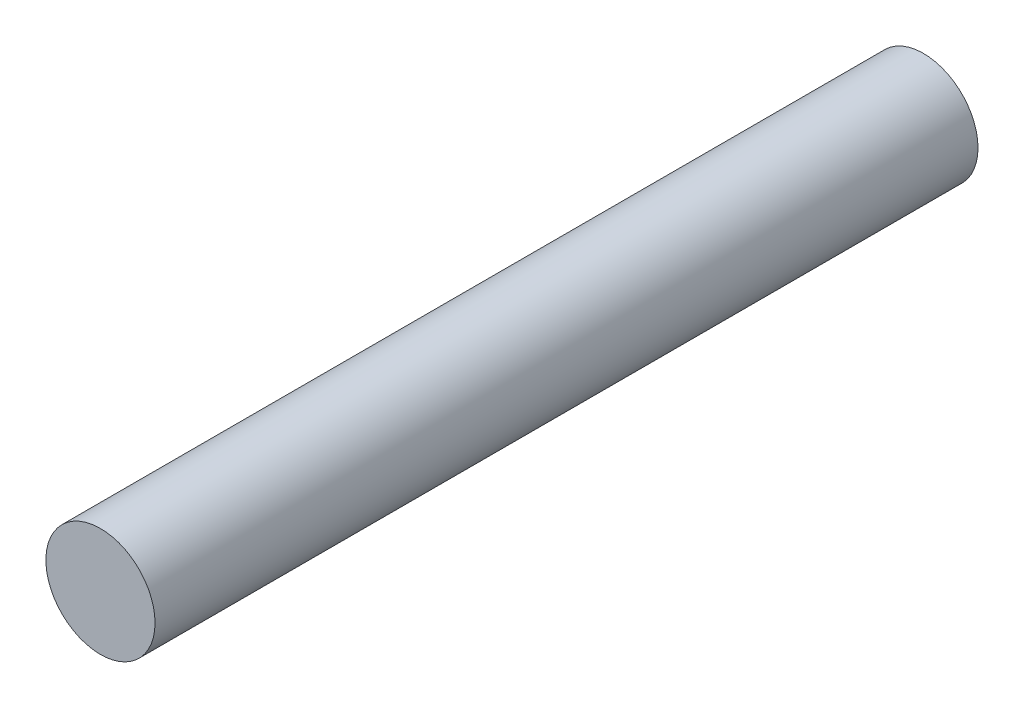
ISO-10303-21;
HEADER;
FILE_DESCRIPTION(('STEP AP214'),'2;1');
FILE_NAME('part.step','',(''),(''),'','','');
FILE_SCHEMA(('AUTOMOTIVE_DESIGN { 1 0 10303 214 1 1 1 1 }'));
ENDSEC;
DATA;
#1=APPLICATION_CONTEXT('core data for automotive mechanical design processes');
#2=APPLICATION_PROTOCOL_DEFINITION('international standard','automotive_design',2000,#1);
#3=PRODUCT_CONTEXT('',#1,'mechanical');
#4=PRODUCT('Part','Part','',(#3));
#5=PRODUCT_RELATED_PRODUCT_CATEGORY('part','',(#4));
#6=PRODUCT_DEFINITION_FORMATION('','',#4);
#7=PRODUCT_DEFINITION_CONTEXT('part definition',#1,'design');
#8=PRODUCT_DEFINITION('design','',#6,#7);
#9=PRODUCT_DEFINITION_SHAPE('','',#8);
#10=(LENGTH_UNIT() NAMED_UNIT(*) SI_UNIT(.MILLI.,.METRE.));
#11=(NAMED_UNIT(*) PLANE_ANGLE_UNIT() SI_UNIT($,.RADIAN.));
#12=(NAMED_UNIT(*) SI_UNIT($,.STERADIAN.) SOLID_ANGLE_UNIT());
#13=UNCERTAINTY_MEASURE_WITH_UNIT(LENGTH_MEASURE(1.E-05),#10,'distance_accuracy_value','');
#14=(GEOMETRIC_REPRESENTATION_CONTEXT(3) GLOBAL_UNCERTAINTY_ASSIGNED_CONTEXT((#13)) GLOBAL_UNIT_ASSIGNED_CONTEXT((#10,
#11,#12)) REPRESENTATION_CONTEXT('',''));
#15=CARTESIAN_POINT('',(0.,0.,0.));
#16=DIRECTION('',(0.,0.,1.));
#17=DIRECTION('',(1.,0.,0.));
#18=AXIS2_PLACEMENT_3D('',#15,#16,#17);
#19=CARTESIAN_POINT('',(0.,0.,60.325));
#20=DIRECTION('',(0.,0.,-1.));
#21=DIRECTION('',(-1.,0.,0.));
#22=AXIS2_PLACEMENT_3D('',#19,#20,#21);
#23=CYLINDRICAL_SURFACE('',#22,4.);
#24=CARTESIAN_POINT('',(0.,0.,60.325));
#25=DIRECTION('',(0.,0.,1.));
#26=DIRECTION('',(1.,0.,0.));
#27=AXIS2_PLACEMENT_3D('',#24,#25,#26);
#28=CIRCLE('',#27,4.);
#29=CARTESIAN_POINT('',(4.,0.,60.325));
#30=VERTEX_POINT('',#29);
#31=EDGE_CURVE('E10',#30,#30,#28,.T.);
#32=ORIENTED_EDGE('',*,*,#31,.F.);
#33=EDGE_LOOP('',(#32));
#34=FACE_BOUND('',#33,.T.);
#35=CARTESIAN_POINT('',(0.,0.,0.));
#36=DIRECTION('',(0.,0.,1.));
#37=DIRECTION('',(1.,0.,0.));
#38=AXIS2_PLACEMENT_3D('',#35,#36,#37);
#39=CIRCLE('',#38,4.);
#40=CARTESIAN_POINT('',(4.,0.,0.));
#41=VERTEX_POINT('',#40);
#42=EDGE_CURVE('E35',#41,#41,#39,.T.);
#43=ORIENTED_EDGE('',*,*,#42,.T.);
#44=EDGE_LOOP('',(#43));
#45=FACE_BOUND('',#44,.T.);
#46=ADVANCED_FACE('F32',(#34,#45),#23,.T.);
#47=CARTESIAN_POINT('',(0.,0.,60.325));
#48=DIRECTION('',(0.,0.,1.));
#49=DIRECTION('',(1.,0.,0.));
#50=AXIS2_PLACEMENT_3D('',#47,#48,#49);
#51=PLANE('',#50);
#52=ORIENTED_EDGE('',*,*,#31,.T.);
#53=EDGE_LOOP('',(#52));
#54=FACE_BOUND('',#53,.T.);
#55=ADVANCED_FACE('F47',(#54),#51,.T.);
#56=CARTESIAN_POINT('',(0.,0.,0.));
#57=DIRECTION('',(0.,0.,1.));
#58=DIRECTION('',(1.,0.,0.));
#59=AXIS2_PLACEMENT_3D('',#56,#57,#58);
#60=PLANE('',#59);
#61=ORIENTED_EDGE('',*,*,#42,.F.);
#62=EDGE_LOOP('',(#61));
#63=FACE_BOUND('',#62,.T.);
#64=ADVANCED_FACE('F45',(#63),#60,.F.);
#65=CLOSED_SHELL('',(#46,#55,#64));
#66=MANIFOLD_SOLID_BREP('B2',#65);
#67=ADVANCED_BREP_SHAPE_REPRESENTATION('',(#18,#66),#14);
#68=SHAPE_DEFINITION_REPRESENTATION(#9,#67);
ENDSEC;
END-ISO-10303-21;
